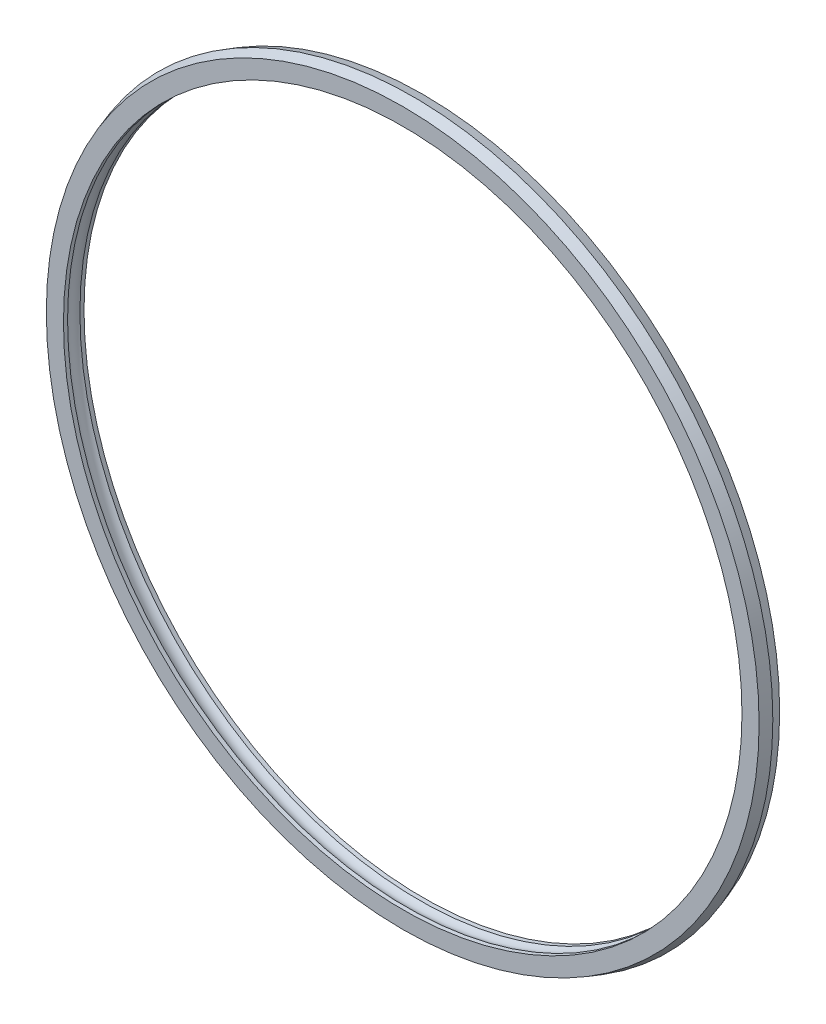
ISO-10303-21;
HEADER;
FILE_DESCRIPTION(('STEP AP214'),'2;1');
FILE_NAME('part.step','',(''),(''),'','','');
FILE_SCHEMA(('AUTOMOTIVE_DESIGN { 1 0 10303 214 1 1 1 1 }'));
ENDSEC;
DATA;
#1=APPLICATION_CONTEXT('core data for automotive mechanical design processes');
#2=APPLICATION_PROTOCOL_DEFINITION('international standard','automotive_design',2000,#1);
#3=PRODUCT_CONTEXT('',#1,'mechanical');
#4=PRODUCT('Part','Part','',(#3));
#5=PRODUCT_RELATED_PRODUCT_CATEGORY('part','',(#4));
#6=PRODUCT_DEFINITION_FORMATION('','',#4);
#7=PRODUCT_DEFINITION_CONTEXT('part definition',#1,'design');
#8=PRODUCT_DEFINITION('design','',#6,#7);
#9=PRODUCT_DEFINITION_SHAPE('','',#8);
#10=(LENGTH_UNIT() NAMED_UNIT(*) SI_UNIT(.MILLI.,.METRE.));
#11=(NAMED_UNIT(*) PLANE_ANGLE_UNIT() SI_UNIT($,.RADIAN.));
#12=(NAMED_UNIT(*) SI_UNIT($,.STERADIAN.) SOLID_ANGLE_UNIT());
#13=UNCERTAINTY_MEASURE_WITH_UNIT(LENGTH_MEASURE(1.E-05),#10,'distance_accuracy_value','');
#14=(GEOMETRIC_REPRESENTATION_CONTEXT(3) GLOBAL_UNCERTAINTY_ASSIGNED_CONTEXT((#13)) GLOBAL_UNIT_ASSIGNED_CONTEXT((#10,
#11,#12)) REPRESENTATION_CONTEXT('',''));
#15=CARTESIAN_POINT('',(0.,0.,0.));
#16=DIRECTION('',(0.,0.,1.));
#17=DIRECTION('',(1.,0.,0.));
#18=AXIS2_PLACEMENT_3D('',#15,#16,#17);
#19=CARTESIAN_POINT('',(0.,0.,0.));
#20=DIRECTION('',(0.,0.,-1.));
#21=DIRECTION('',(-1.,0.,0.));
#22=AXIS2_PLACEMENT_3D('',#19,#20,#21);
#23=CONICAL_SURFACE('',#22,52.5,0.321750554396642);
#24=CARTESIAN_POINT('',(0.,0.,1.5));
#25=DIRECTION('',(0.,0.,1.));
#26=DIRECTION('',(1.,0.,0.));
#27=AXIS2_PLACEMENT_3D('',#24,#25,#26);
#28=CIRCLE('',#27,52.);
#29=CARTESIAN_POINT('',(52.,0.,1.5));
#30=VERTEX_POINT('',#29);
#31=EDGE_CURVE('E70',#30,#30,#28,.T.);
#32=ORIENTED_EDGE('',*,*,#31,.F.);
#33=EDGE_LOOP('',(#32));
#34=FACE_BOUND('',#33,.T.);
#35=CARTESIAN_POINT('',(0.,0.,0.));
#36=DIRECTION('',(0.,0.,1.));
#37=DIRECTION('',(1.,0.,0.));
#38=AXIS2_PLACEMENT_3D('',#35,#36,#37);
#39=CIRCLE('',#38,52.5);
#40=CARTESIAN_POINT('',(52.5,0.,0.));
#41=VERTEX_POINT('',#40);
#42=EDGE_CURVE('E10',#41,#41,#39,.T.);
#43=ORIENTED_EDGE('',*,*,#42,.T.);
#44=EDGE_LOOP('',(#43));
#45=FACE_BOUND('',#44,.T.);
#46=ADVANCED_FACE('F45',(#34,#45),#23,.T.);
#47=CARTESIAN_POINT('',(0.,0.,-1.5));
#48=DIRECTION('',(0.,0.,1.));
#49=DIRECTION('',(1.,0.,0.));
#50=AXIS2_PLACEMENT_3D('',#47,#48,#49);
#51=CONICAL_SURFACE('',#50,52.,0.321750554396642);
#52=ORIENTED_EDGE('',*,*,#42,.F.);
#53=EDGE_LOOP('',(#52));
#54=FACE_BOUND('',#53,.T.);
#55=CARTESIAN_POINT('',(0.,0.,-1.5));
#56=DIRECTION('',(0.,0.,1.));
#57=DIRECTION('',(1.,0.,0.));
#58=AXIS2_PLACEMENT_3D('',#55,#56,#57);
#59=CIRCLE('',#58,52.);
#60=CARTESIAN_POINT('',(52.,0.,-1.5));
#61=VERTEX_POINT('',#60);
#62=EDGE_CURVE('E51',#61,#61,#59,.T.);
#63=ORIENTED_EDGE('',*,*,#62,.T.);
#64=EDGE_LOOP('',(#63));
#65=FACE_BOUND('',#64,.T.);
#66=ADVANCED_FACE('F77',(#54,#65),#51,.T.);
#67=CARTESIAN_POINT('',(0.,52.,-1.5));
#68=DIRECTION('',(0.,0.,1.));
#69=DIRECTION('',(1.,0.,0.));
#70=AXIS2_PLACEMENT_3D('',#67,#68,#69);
#71=PLANE('',#70);
#72=ORIENTED_EDGE('',*,*,#62,.F.);
#73=EDGE_LOOP('',(#72));
#74=FACE_BOUND('',#73,.T.);
#75=CARTESIAN_POINT('',(0.,0.,-1.5));
#76=DIRECTION('',(0.,0.,1.));
#77=DIRECTION('',(1.,0.,0.));
#78=AXIS2_PLACEMENT_3D('',#75,#76,#77);
#79=CIRCLE('',#78,49.5);
#80=CARTESIAN_POINT('',(49.5,0.,-1.5));
#81=VERTEX_POINT('',#80);
#82=EDGE_CURVE('E55',#81,#81,#79,.T.);
#83=ORIENTED_EDGE('',*,*,#82,.T.);
#84=EDGE_LOOP('',(#83));
#85=FACE_BOUND('',#84,.T.);
#86=ADVANCED_FACE('F81',(#74,#85),#71,.F.);
#87=CARTESIAN_POINT('',(0.,0.,0.));
#88=DIRECTION('',(0.,0.,1.));
#89=DIRECTION('',(1.,0.,0.));
#90=AXIS2_PLACEMENT_3D('',#87,#88,#89);
#91=CYLINDRICAL_SURFACE('',#90,49.5);
#92=ORIENTED_EDGE('',*,*,#82,.F.);
#93=EDGE_LOOP('',(#92));
#94=FACE_BOUND('',#93,.T.);
#95=CARTESIAN_POINT('',(0.,0.,-0.9));
#96=DIRECTION('',(0.,0.,1.));
#97=DIRECTION('',(1.,0.,0.));
#98=AXIS2_PLACEMENT_3D('',#95,#96,#97);
#99=CIRCLE('',#98,49.5);
#100=CARTESIAN_POINT('',(49.5,0.,-0.9));
#101=VERTEX_POINT('',#100);
#102=EDGE_CURVE('E59',#101,#101,#99,.T.);
#103=ORIENTED_EDGE('',*,*,#102,.T.);
#104=EDGE_LOOP('',(#103));
#105=FACE_BOUND('',#104,.T.);
#106=ADVANCED_FACE('F86',(#94,#105),#91,.F.);
#107=CARTESIAN_POINT('',(0.,0.,0.));
#108=DIRECTION('',(0.,0.,1.));
#109=DIRECTION('',(1.,0.,0.));
#110=AXIS2_PLACEMENT_3D('',#107,#108,#109);
#111=TOROIDAL_SURFACE('',#110,48.3,1.5);
#112=ORIENTED_EDGE('',*,*,#102,.F.);
#113=EDGE_LOOP('',(#112));
#114=FACE_BOUND('',#113,.T.);
#115=CARTESIAN_POINT('',(0.,0.,0.9));
#116=DIRECTION('',(0.,0.,1.));
#117=DIRECTION('',(1.,0.,0.));
#118=AXIS2_PLACEMENT_3D('',#115,#116,#117);
#119=CIRCLE('',#118,49.5);
#120=CARTESIAN_POINT('',(49.5,0.,0.9));
#121=VERTEX_POINT('',#120);
#122=EDGE_CURVE('E64',#121,#121,#119,.T.);
#123=ORIENTED_EDGE('',*,*,#122,.T.);
#124=EDGE_LOOP('',(#123));
#125=FACE_BOUND('',#124,.T.);
#126=ADVANCED_FACE('F92',(#114,#125),#111,.F.);
#127=CARTESIAN_POINT('',(0.,0.,0.));
#128=DIRECTION('',(0.,0.,1.));
#129=DIRECTION('',(1.,0.,0.));
#130=AXIS2_PLACEMENT_3D('',#127,#128,#129);
#131=CYLINDRICAL_SURFACE('',#130,49.5);
#132=ORIENTED_EDGE('',*,*,#122,.F.);
#133=EDGE_LOOP('',(#132));
#134=FACE_BOUND('',#133,.T.);
#135=CARTESIAN_POINT('',(0.,0.,1.5));
#136=DIRECTION('',(0.,0.,1.));
#137=DIRECTION('',(1.,0.,0.));
#138=AXIS2_PLACEMENT_3D('',#135,#136,#137);
#139=CIRCLE('',#138,49.5);
#140=CARTESIAN_POINT('',(49.5,0.,1.5));
#141=VERTEX_POINT('',#140);
#142=EDGE_CURVE('E67',#141,#141,#139,.T.);
#143=ORIENTED_EDGE('',*,*,#142,.T.);
#144=EDGE_LOOP('',(#143));
#145=FACE_BOUND('',#144,.T.);
#146=ADVANCED_FACE('F96',(#134,#145),#131,.F.);
#147=CARTESIAN_POINT('',(0.,52.,1.5));
#148=DIRECTION('',(0.,0.,-1.));
#149=DIRECTION('',(-1.,0.,0.));
#150=AXIS2_PLACEMENT_3D('',#147,#148,#149);
#151=PLANE('',#150);
#152=ORIENTED_EDGE('',*,*,#142,.F.);
#153=EDGE_LOOP('',(#152));
#154=FACE_BOUND('',#153,.T.);
#155=ORIENTED_EDGE('',*,*,#31,.T.);
#156=EDGE_LOOP('',(#155));
#157=FACE_BOUND('',#156,.T.);
#158=ADVANCED_FACE('F74',(#154,#157),#151,.F.);
#159=CLOSED_SHELL('',(#46,#66,#86,#106,#126,#146,#158));
#160=MANIFOLD_SOLID_BREP('B2',#159);
#161=ADVANCED_BREP_SHAPE_REPRESENTATION('',(#18,#160),#14);
#162=SHAPE_DEFINITION_REPRESENTATION(#9,#161);
ENDSEC;
END-ISO-10303-21;
